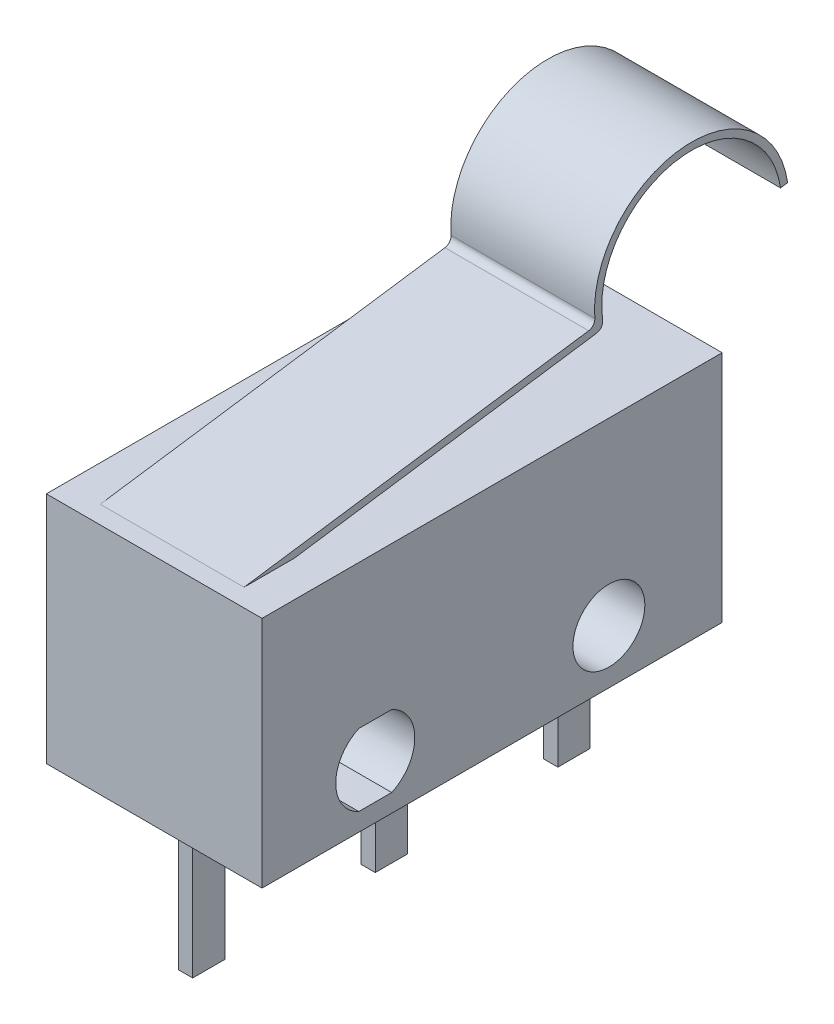
ISO-10303-21;
HEADER;
FILE_DESCRIPTION(('STEP AP214'),'2;1');
FILE_NAME('part.step','',(''),(''),'','','');
FILE_SCHEMA(('AUTOMOTIVE_DESIGN { 1 0 10303 214 1 1 1 1 }'));
ENDSEC;
DATA;
#1=APPLICATION_CONTEXT('core data for automotive mechanical design processes');
#2=APPLICATION_PROTOCOL_DEFINITION('international standard','automotive_design',2000,#1);
#3=PRODUCT_CONTEXT('',#1,'mechanical');
#4=PRODUCT('Part','Part','',(#3));
#5=PRODUCT_RELATED_PRODUCT_CATEGORY('part','',(#4));
#6=PRODUCT_DEFINITION_FORMATION('','',#4);
#7=PRODUCT_DEFINITION_CONTEXT('part definition',#1,'design');
#8=PRODUCT_DEFINITION('design','',#6,#7);
#9=PRODUCT_DEFINITION_SHAPE('','',#8);
#10=(LENGTH_UNIT() NAMED_UNIT(*) SI_UNIT(.MILLI.,.METRE.));
#11=(NAMED_UNIT(*) PLANE_ANGLE_UNIT() SI_UNIT($,.RADIAN.));
#12=(NAMED_UNIT(*) SI_UNIT($,.STERADIAN.) SOLID_ANGLE_UNIT());
#13=UNCERTAINTY_MEASURE_WITH_UNIT(LENGTH_MEASURE(1.E-05),#10,'distance_accuracy_value','');
#14=(GEOMETRIC_REPRESENTATION_CONTEXT(3) GLOBAL_UNCERTAINTY_ASSIGNED_CONTEXT((#13)) GLOBAL_UNIT_ASSIGNED_CONTEXT((#10,
#11,#12)) REPRESENTATION_CONTEXT('',''));
#15=CARTESIAN_POINT('',(0.,0.,0.));
#16=DIRECTION('',(0.,0.,1.));
#17=DIRECTION('',(1.,0.,0.));
#18=AXIS2_PLACEMENT_3D('',#15,#16,#17);
#19=CARTESIAN_POINT('',(3.,3.25,-6.4));
#20=DIRECTION('',(0.,-1.,0.));
#21=DIRECTION('',(0.,0.,-1.));
#22=AXIS2_PLACEMENT_3D('',#19,#20,#21);
#23=PLANE('',#22);
#24=DIRECTION('',(-1.,0.,0.));
#25=VECTOR('',#24,1.);
#26=CARTESIAN_POINT('',(0.5,3.25,1.82));
#27=LINE('',#26,#25);
#28=CARTESIAN_POINT('',(0.5,3.25,1.82));
#29=VERTEX_POINT('',#28);
#30=CARTESIAN_POINT('',(-0.5,3.25,1.82));
#31=VERTEX_POINT('',#30);
#32=EDGE_CURVE('E56',#29,#31,#27,.T.);
#33=ORIENTED_EDGE('',*,*,#32,.F.);
#34=DIRECTION('',(0.,0.,-1.));
#35=VECTOR('',#34,1.);
#36=CARTESIAN_POINT('',(0.5,3.25,2.48));
#37=LINE('',#36,#35);
#38=CARTESIAN_POINT('',(0.5,3.25,2.48));
#39=VERTEX_POINT('',#38);
#40=EDGE_CURVE('E51',#39,#29,#37,.T.);
#41=ORIENTED_EDGE('',*,*,#40,.F.);
#42=DIRECTION('',(-1.,0.,0.));
#43=VECTOR('',#42,1.);
#44=CARTESIAN_POINT('',(0.5,3.25,2.48));
#45=LINE('',#44,#43);
#46=CARTESIAN_POINT('',(-0.5,3.25,2.48));
#47=VERTEX_POINT('',#46);
#48=EDGE_CURVE('E228',#39,#47,#45,.T.);
#49=ORIENTED_EDGE('',*,*,#48,.T.);
#50=DIRECTION('',(0.,0.,-1.));
#51=VECTOR('',#50,1.);
#52=CARTESIAN_POINT('',(-0.5,3.25,2.48));
#53=LINE('',#52,#51);
#54=EDGE_CURVE('E231',#47,#31,#53,.T.);
#55=ORIENTED_EDGE('',*,*,#54,.T.);
#56=EDGE_LOOP('',(#33,#41,#49,#55));
#57=FACE_BOUND('',#56,.T.);
#58=DIRECTION('',(0.,0.,1.));
#59=VECTOR('',#58,1.);
#60=CARTESIAN_POINT('',(-3.,3.25,-6.4));
#61=LINE('',#60,#59);
#62=CARTESIAN_POINT('',(-3.,3.25,-6.4));
#63=VERTEX_POINT('',#62);
#64=CARTESIAN_POINT('',(-3.,3.25,6.4));
#65=VERTEX_POINT('',#64);
#66=EDGE_CURVE('E423',#63,#65,#61,.T.);
#67=ORIENTED_EDGE('',*,*,#66,.T.);
#68=DIRECTION('',(-1.,0.,0.));
#69=VECTOR('',#68,1.);
#70=CARTESIAN_POINT('',(3.,3.25,6.4));
#71=LINE('',#70,#69);
#72=CARTESIAN_POINT('',(3.,3.25,6.4));
#73=VERTEX_POINT('',#72);
#74=EDGE_CURVE('E429',#73,#65,#71,.T.);
#75=ORIENTED_EDGE('',*,*,#74,.F.);
#76=DIRECTION('',(0.,0.,1.));
#77=VECTOR('',#76,1.);
#78=CARTESIAN_POINT('',(3.,3.25,-6.4));
#79=LINE('',#78,#77);
#80=CARTESIAN_POINT('',(3.,3.25,-6.4));
#81=VERTEX_POINT('',#80);
#82=EDGE_CURVE('E427',#81,#73,#79,.T.);
#83=ORIENTED_EDGE('',*,*,#82,.F.);
#84=DIRECTION('',(-1.,0.,0.));
#85=VECTOR('',#84,1.);
#86=CARTESIAN_POINT('',(3.,3.25,-6.4));
#87=LINE('',#86,#85);
#88=EDGE_CURVE('E439',#81,#63,#87,.T.);
#89=ORIENTED_EDGE('',*,*,#88,.T.);
#90=EDGE_LOOP('',(#67,#75,#83,#89));
#91=FACE_BOUND('',#90,.T.);
#92=DIRECTION('',(0.,0.,-1.));
#93=VECTOR('',#92,1.);
#94=CARTESIAN_POINT('',(2.,3.25,4.5022836084845));
#95=LINE('',#94,#93);
#96=CARTESIAN_POINT('',(2.,3.25,5.9));
#97=VERTEX_POINT('',#96);
#98=CARTESIAN_POINT('',(2.,3.25,4.5022836084845));
#99=VERTEX_POINT('',#98);
#100=EDGE_CURVE('E249',#97,#99,#95,.T.);
#101=ORIENTED_EDGE('',*,*,#100,.F.);
#102=DIRECTION('',(-1.,0.,0.));
#103=VECTOR('',#102,1.);
#104=CARTESIAN_POINT('',(2.,3.25,5.9));
#105=LINE('',#104,#103);
#106=CARTESIAN_POINT('',(-2.,3.25,5.9));
#107=VERTEX_POINT('',#106);
#108=EDGE_CURVE('E265',#97,#107,#105,.T.);
#109=ORIENTED_EDGE('',*,*,#108,.T.);
#110=DIRECTION('',(0.,0.,-1.));
#111=VECTOR('',#110,1.);
#112=CARTESIAN_POINT('',(-2.,3.25,4.5022836084845));
#113=LINE('',#112,#111);
#114=CARTESIAN_POINT('',(-2.,3.25,4.5022836084845));
#115=VERTEX_POINT('',#114);
#116=EDGE_CURVE('E235',#107,#115,#113,.T.);
#117=ORIENTED_EDGE('',*,*,#116,.T.);
#118=DIRECTION('',(-1.,0.,0.));
#119=VECTOR('',#118,1.);
#120=CARTESIAN_POINT('',(2.,3.25,4.5022836084845));
#121=LINE('',#120,#119);
#122=EDGE_CURVE('E287',#99,#115,#121,.T.);
#123=ORIENTED_EDGE('',*,*,#122,.F.);
#124=EDGE_LOOP('',(#101,#109,#117,#123));
#125=FACE_BOUND('',#124,.T.);
#126=ADVANCED_FACE('F36',(#57,#91,#125),#23,.F.);
#127=CARTESIAN_POINT('',(3.,-3.25,-6.4));
#128=DIRECTION('',(0.,1.,0.));
#129=DIRECTION('',(0.,0.,1.));
#130=AXIS2_PLACEMENT_3D('',#127,#128,#129);
#131=PLANE('',#130);
#132=DIRECTION('',(-1.,0.,0.));
#133=VECTOR('',#132,1.);
#134=CARTESIAN_POINT('',(0.2,-3.25,-4.63));
#135=LINE('',#134,#133);
#136=CARTESIAN_POINT('',(0.2,-3.25,-4.63));
#137=VERTEX_POINT('',#136);
#138=CARTESIAN_POINT('',(-0.2,-3.25,-4.63));
#139=VERTEX_POINT('',#138);
#140=EDGE_CURVE('E302',#137,#139,#135,.T.);
#141=ORIENTED_EDGE('',*,*,#140,.F.);
#142=DIRECTION('',(0.,0.,1.));
#143=VECTOR('',#142,1.);
#144=CARTESIAN_POINT('',(0.2,-3.25,-4.63));
#145=LINE('',#144,#143);
#146=CARTESIAN_POINT('',(0.2,-3.25,-5.53));
#147=VERTEX_POINT('',#146);
#148=EDGE_CURVE('E299',#147,#137,#145,.T.);
#149=ORIENTED_EDGE('',*,*,#148,.F.);
#150=DIRECTION('',(-1.,0.,0.));
#151=VECTOR('',#150,1.);
#152=CARTESIAN_POINT('',(0.2,-3.25,-5.53));
#153=LINE('',#152,#151);
#154=CARTESIAN_POINT('',(-0.2,-3.25,-5.53));
#155=VERTEX_POINT('',#154);
#156=EDGE_CURVE('E313',#147,#155,#153,.T.);
#157=ORIENTED_EDGE('',*,*,#156,.T.);
#158=DIRECTION('',(0.,0.,1.));
#159=VECTOR('',#158,1.);
#160=CARTESIAN_POINT('',(-0.2,-3.25,-4.63));
#161=LINE('',#160,#159);
#162=EDGE_CURVE('E294',#155,#139,#161,.T.);
#163=ORIENTED_EDGE('',*,*,#162,.T.);
#164=EDGE_LOOP('',(#141,#149,#157,#163));
#165=FACE_BOUND('',#164,.T.);
#166=DIRECTION('',(0.,0.,-1.));
#167=VECTOR('',#166,1.);
#168=CARTESIAN_POINT('',(-3.,-3.25,-6.4));
#169=LINE('',#168,#167);
#170=CARTESIAN_POINT('',(-3.,-3.25,6.4));
#171=VERTEX_POINT('',#170);
#172=CARTESIAN_POINT('',(-3.,-3.25,-6.4));
#173=VERTEX_POINT('',#172);
#174=EDGE_CURVE('E432',#171,#173,#169,.T.);
#175=ORIENTED_EDGE('',*,*,#174,.T.);
#176=DIRECTION('',(-1.,0.,0.));
#177=VECTOR('',#176,1.);
#178=CARTESIAN_POINT('',(3.,-3.25,-6.4));
#179=LINE('',#178,#177);
#180=CARTESIAN_POINT('',(3.,-3.25,-6.4));
#181=VERTEX_POINT('',#180);
#182=EDGE_CURVE('E442',#181,#173,#179,.T.);
#183=ORIENTED_EDGE('',*,*,#182,.F.);
#184=DIRECTION('',(0.,0.,-1.));
#185=VECTOR('',#184,1.);
#186=CARTESIAN_POINT('',(3.,-3.25,-6.4));
#187=LINE('',#186,#185);
#188=CARTESIAN_POINT('',(3.,-3.25,6.4));
#189=VERTEX_POINT('',#188);
#190=EDGE_CURVE('E422',#189,#181,#187,.T.);
#191=ORIENTED_EDGE('',*,*,#190,.F.);
#192=DIRECTION('',(-1.,0.,0.));
#193=VECTOR('',#192,1.);
#194=CARTESIAN_POINT('',(3.,-3.25,6.4));
#195=LINE('',#194,#193);
#196=EDGE_CURVE('E445',#189,#171,#195,.T.);
#197=ORIENTED_EDGE('',*,*,#196,.T.);
#198=EDGE_LOOP('',(#175,#183,#191,#197));
#199=FACE_BOUND('',#198,.T.);
#200=DIRECTION('',(-1.,0.,0.));
#201=VECTOR('',#200,1.);
#202=CARTESIAN_POINT('',(0.2,-3.25,5.53));
#203=LINE('',#202,#201);
#204=CARTESIAN_POINT('',(0.2,-3.25,5.53));
#205=VERTEX_POINT('',#204);
#206=CARTESIAN_POINT('',(-0.2,-3.25,5.53));
#207=VERTEX_POINT('',#206);
#208=EDGE_CURVE('E378',#205,#207,#203,.T.);
#209=ORIENTED_EDGE('',*,*,#208,.F.);
#210=DIRECTION('',(0.,0.,1.));
#211=VECTOR('',#210,1.);
#212=CARTESIAN_POINT('',(0.2,-3.25,4.63));
#213=LINE('',#212,#211);
#214=CARTESIAN_POINT('',(0.2,-3.25,4.63));
#215=VERTEX_POINT('',#214);
#216=EDGE_CURVE('E352',#215,#205,#213,.T.);
#217=ORIENTED_EDGE('',*,*,#216,.F.);
#218=DIRECTION('',(-1.,0.,0.));
#219=VECTOR('',#218,1.);
#220=CARTESIAN_POINT('',(0.2,-3.25,4.63));
#221=LINE('',#220,#219);
#222=CARTESIAN_POINT('',(-0.2,-3.25,4.63));
#223=VERTEX_POINT('',#222);
#224=EDGE_CURVE('E363',#215,#223,#221,.T.);
#225=ORIENTED_EDGE('',*,*,#224,.T.);
#226=DIRECTION('',(0.,0.,1.));
#227=VECTOR('',#226,1.);
#228=CARTESIAN_POINT('',(-0.2,-3.25,4.63));
#229=LINE('',#228,#227);
#230=EDGE_CURVE('E351',#223,#207,#229,.T.);
#231=ORIENTED_EDGE('',*,*,#230,.T.);
#232=EDGE_LOOP('',(#209,#217,#225,#231));
#233=FACE_BOUND('',#232,.T.);
#234=DIRECTION('',(0.,0.,1.));
#235=VECTOR('',#234,1.);
#236=CARTESIAN_POINT('',(0.2,-3.25,-0.45));
#237=LINE('',#236,#235);
#238=CARTESIAN_POINT('',(0.2,-3.25,-0.45));
#239=VERTEX_POINT('',#238);
#240=CARTESIAN_POINT('',(0.2,-3.25,0.45));
#241=VERTEX_POINT('',#240);
#242=EDGE_CURVE('E324',#239,#241,#237,.T.);
#243=ORIENTED_EDGE('',*,*,#242,.F.);
#244=DIRECTION('',(-1.,0.,0.));
#245=VECTOR('',#244,1.);
#246=CARTESIAN_POINT('',(0.2,-3.25,-0.45));
#247=LINE('',#246,#245);
#248=CARTESIAN_POINT('',(-0.2,-3.25,-0.45));
#249=VERTEX_POINT('',#248);
#250=EDGE_CURVE('E348',#239,#249,#247,.T.);
#251=ORIENTED_EDGE('',*,*,#250,.T.);
#252=DIRECTION('',(0.,0.,1.));
#253=VECTOR('',#252,1.);
#254=CARTESIAN_POINT('',(-0.2,-3.25,-0.45));
#255=LINE('',#254,#253);
#256=CARTESIAN_POINT('',(-0.2,-3.25,0.450000000000001));
#257=VERTEX_POINT('',#256);
#258=EDGE_CURVE('E334',#249,#257,#255,.T.);
#259=ORIENTED_EDGE('',*,*,#258,.T.);
#260=DIRECTION('',(-1.,0.,0.));
#261=VECTOR('',#260,1.);
#262=CARTESIAN_POINT('',(0.2,-3.25,0.45));
#263=LINE('',#262,#261);
#264=EDGE_CURVE('E345',#241,#257,#263,.T.);
#265=ORIENTED_EDGE('',*,*,#264,.F.);
#266=EDGE_LOOP('',(#243,#251,#259,#265));
#267=FACE_BOUND('',#266,.T.);
#268=ADVANCED_FACE('F509',(#165,#199,#233,#267),#131,.F.);
#269=CARTESIAN_POINT('',(3.,0.,0.));
#270=DIRECTION('',(-1.,0.,0.));
#271=DIRECTION('',(0.,0.,1.));
#272=AXIS2_PLACEMENT_3D('',#269,#270,#271);
#273=PLANE('',#272);
#274=CARTESIAN_POINT('',(3.,-1.75,-3.25));
#275=DIRECTION('',(1.,0.,0.));
#276=DIRECTION('',(0.,0.,-1.));
#277=AXIS2_PLACEMENT_3D('',#274,#275,#276);
#278=CIRCLE('',#277,0.999999999999999);
#279=CARTESIAN_POINT('',(3.,-1.75,-4.25));
#280=VERTEX_POINT('',#279);
#281=EDGE_CURVE('E413',#280,#280,#278,.T.);
#282=ORIENTED_EDGE('',*,*,#281,.F.);
#283=EDGE_LOOP('',(#282));
#284=FACE_BOUND('',#283,.T.);
#285=DIRECTION('',(0.,-1.,0.));
#286=VECTOR('',#285,1.);
#287=CARTESIAN_POINT('',(3.,3.25,6.4));
#288=LINE('',#287,#286);
#289=EDGE_CURVE('E419',#73,#189,#288,.T.);
#290=ORIENTED_EDGE('',*,*,#289,.T.);
#291=ORIENTED_EDGE('',*,*,#190,.T.);
#292=DIRECTION('',(0.,1.,0.));
#293=VECTOR('',#292,1.);
#294=CARTESIAN_POINT('',(3.,3.25,-6.4));
#295=LINE('',#294,#293);
#296=EDGE_CURVE('E425',#181,#81,#295,.T.);
#297=ORIENTED_EDGE('',*,*,#296,.T.);
#298=ORIENTED_EDGE('',*,*,#82,.T.);
#299=EDGE_LOOP('',(#290,#291,#297,#298));
#300=FACE_BOUND('',#299,.T.);
#301=CARTESIAN_POINT('',(3.,-1.75,3.25));
#302=DIRECTION('',(1.,0.,0.));
#303=DIRECTION('',(0.,0.,-1.));
#304=AXIS2_PLACEMENT_3D('',#301,#302,#303);
#305=CIRCLE('',#304,1.1);
#306=CARTESIAN_POINT('',(3.,-0.75,3.70825756949558));
#307=VERTEX_POINT('',#306);
#308=CARTESIAN_POINT('',(3.,-2.75,3.70825756949558));
#309=VERTEX_POINT('',#308);
#310=EDGE_CURVE('E382',#307,#309,#305,.T.);
#311=ORIENTED_EDGE('',*,*,#310,.F.);
#312=DIRECTION('',(0.,0.,1.));
#313=VECTOR('',#312,1.);
#314=CARTESIAN_POINT('',(3.,-0.75,3.70825756949558));
#315=LINE('',#314,#313);
#316=CARTESIAN_POINT('',(3.,-0.75,2.79174243050441));
#317=VERTEX_POINT('',#316);
#318=EDGE_CURVE('E390',#317,#307,#315,.T.);
#319=ORIENTED_EDGE('',*,*,#318,.F.);
#320=CARTESIAN_POINT('',(3.,-1.75,3.25));
#321=DIRECTION('',(1.,0.,0.));
#322=DIRECTION('',(0.,0.,-1.));
#323=AXIS2_PLACEMENT_3D('',#320,#321,#322);
#324=CIRCLE('',#323,1.1);
#325=CARTESIAN_POINT('',(3.,-2.75,2.79174243050442));
#326=VERTEX_POINT('',#325);
#327=EDGE_CURVE('E387',#326,#317,#324,.T.);
#328=ORIENTED_EDGE('',*,*,#327,.F.);
#329=DIRECTION('',(0.,0.,-1.));
#330=VECTOR('',#329,1.);
#331=CARTESIAN_POINT('',(3.,-2.75,3.70825756949558));
#332=LINE('',#331,#330);
#333=EDGE_CURVE('E384',#309,#326,#332,.T.);
#334=ORIENTED_EDGE('',*,*,#333,.F.);
#335=EDGE_LOOP('',(#311,#319,#328,#334));
#336=FACE_BOUND('',#335,.T.);
#337=ADVANCED_FACE('F514',(#284,#300,#336),#273,.F.);
#338=CARTESIAN_POINT('',(-3.,0.,0.));
#339=DIRECTION('',(-1.,0.,0.));
#340=DIRECTION('',(0.,0.,1.));
#341=AXIS2_PLACEMENT_3D('',#338,#339,#340);
#342=PLANE('',#341);
#343=DIRECTION('',(0.,-1.,0.));
#344=VECTOR('',#343,1.);
#345=CARTESIAN_POINT('',(-3.,3.25,6.4));
#346=LINE('',#345,#344);
#347=EDGE_CURVE('E416',#65,#171,#346,.T.);
#348=ORIENTED_EDGE('',*,*,#347,.F.);
#349=ORIENTED_EDGE('',*,*,#66,.F.);
#350=DIRECTION('',(0.,1.,0.));
#351=VECTOR('',#350,1.);
#352=CARTESIAN_POINT('',(-3.,3.25,-6.4));
#353=LINE('',#352,#351);
#354=EDGE_CURVE('E434',#173,#63,#353,.T.);
#355=ORIENTED_EDGE('',*,*,#354,.F.);
#356=ORIENTED_EDGE('',*,*,#174,.F.);
#357=EDGE_LOOP('',(#348,#349,#355,#356));
#358=FACE_BOUND('',#357,.T.);
#359=CARTESIAN_POINT('',(-3.,-1.75,-3.25));
#360=DIRECTION('',(1.,0.,0.));
#361=DIRECTION('',(0.,0.,-1.));
#362=AXIS2_PLACEMENT_3D('',#359,#360,#361);
#363=CIRCLE('',#362,0.999999999999999);
#364=CARTESIAN_POINT('',(-3.,-1.75,-4.25));
#365=VERTEX_POINT('',#364);
#366=EDGE_CURVE('E412',#365,#365,#363,.T.);
#367=ORIENTED_EDGE('',*,*,#366,.T.);
#368=EDGE_LOOP('',(#367));
#369=FACE_BOUND('',#368,.T.);
#370=DIRECTION('',(0.,0.,1.));
#371=VECTOR('',#370,1.);
#372=CARTESIAN_POINT('',(-3.,-0.75,3.70825756949558));
#373=LINE('',#372,#371);
#374=CARTESIAN_POINT('',(-3.,-0.75,2.79174243050441));
#375=VERTEX_POINT('',#374);
#376=CARTESIAN_POINT('',(-3.,-0.75,3.70825756949558));
#377=VERTEX_POINT('',#376);
#378=EDGE_CURVE('E385',#375,#377,#373,.T.);
#379=ORIENTED_EDGE('',*,*,#378,.T.);
#380=CARTESIAN_POINT('',(-3.,-1.75,3.25));
#381=DIRECTION('',(1.,0.,0.));
#382=DIRECTION('',(0.,0.,-1.));
#383=AXIS2_PLACEMENT_3D('',#380,#381,#382);
#384=CIRCLE('',#383,1.1);
#385=CARTESIAN_POINT('',(-3.,-2.75,3.70825756949558));
#386=VERTEX_POINT('',#385);
#387=EDGE_CURVE('E381',#377,#386,#384,.T.);
#388=ORIENTED_EDGE('',*,*,#387,.T.);
#389=DIRECTION('',(0.,0.,-1.));
#390=VECTOR('',#389,1.);
#391=CARTESIAN_POINT('',(-3.,-2.75,3.70825756949558));
#392=LINE('',#391,#390);
#393=CARTESIAN_POINT('',(-3.,-2.75,2.79174243050442));
#394=VERTEX_POINT('',#393);
#395=EDGE_CURVE('E395',#386,#394,#392,.T.);
#396=ORIENTED_EDGE('',*,*,#395,.T.);
#397=CARTESIAN_POINT('',(-3.,-1.75,3.25));
#398=DIRECTION('',(1.,0.,0.));
#399=DIRECTION('',(0.,0.,-1.));
#400=AXIS2_PLACEMENT_3D('',#397,#398,#399);
#401=CIRCLE('',#400,1.1);
#402=EDGE_CURVE('E398',#394,#375,#401,.T.);
#403=ORIENTED_EDGE('',*,*,#402,.T.);
#404=EDGE_LOOP('',(#379,#388,#396,#403));
#405=FACE_BOUND('',#404,.T.);
#406=ADVANCED_FACE('F519',(#358,#369,#405),#342,.T.);
#407=CARTESIAN_POINT('',(3.,3.25,6.4));
#408=DIRECTION('',(0.,0.,-1.));
#409=DIRECTION('',(0.,1.,0.));
#410=AXIS2_PLACEMENT_3D('',#407,#408,#409);
#411=PLANE('',#410);
#412=ORIENTED_EDGE('',*,*,#347,.T.);
#413=ORIENTED_EDGE('',*,*,#196,.F.);
#414=ORIENTED_EDGE('',*,*,#289,.F.);
#415=ORIENTED_EDGE('',*,*,#74,.T.);
#416=EDGE_LOOP('',(#412,#413,#414,#415));
#417=FACE_BOUND('',#416,.T.);
#418=ADVANCED_FACE('F524',(#417),#411,.F.);
#419=CARTESIAN_POINT('',(3.,3.25,-6.4));
#420=DIRECTION('',(0.,0.,1.));
#421=DIRECTION('',(1.,0.,0.));
#422=AXIS2_PLACEMENT_3D('',#419,#420,#421);
#423=PLANE('',#422);
#424=ORIENTED_EDGE('',*,*,#354,.T.);
#425=ORIENTED_EDGE('',*,*,#88,.F.);
#426=ORIENTED_EDGE('',*,*,#296,.F.);
#427=ORIENTED_EDGE('',*,*,#182,.T.);
#428=EDGE_LOOP('',(#424,#425,#426,#427));
#429=FACE_BOUND('',#428,.T.);
#430=ADVANCED_FACE('F521',(#429),#423,.F.);
#431=CARTESIAN_POINT('',(3.,-1.75,-3.25));
#432=DIRECTION('',(-1.,0.,0.));
#433=DIRECTION('',(0.,0.,1.));
#434=AXIS2_PLACEMENT_3D('',#431,#432,#433);
#435=CYLINDRICAL_SURFACE('',#434,0.999999999999999);
#436=ORIENTED_EDGE('',*,*,#281,.T.);
#437=EDGE_LOOP('',(#436));
#438=FACE_BOUND('',#437,.T.);
#439=ORIENTED_EDGE('',*,*,#366,.F.);
#440=EDGE_LOOP('',(#439));
#441=FACE_BOUND('',#440,.T.);
#442=ADVANCED_FACE('F523',(#438,#441),#435,.F.);
#443=CARTESIAN_POINT('',(3.,-1.75,3.25));
#444=DIRECTION('',(-1.,0.,0.));
#445=DIRECTION('',(0.,0.,1.));
#446=AXIS2_PLACEMENT_3D('',#443,#444,#445);
#447=CYLINDRICAL_SURFACE('',#446,1.1);
#448=ORIENTED_EDGE('',*,*,#387,.F.);
#449=DIRECTION('',(-1.,0.,0.));
#450=VECTOR('',#449,1.);
#451=CARTESIAN_POINT('',(3.,-0.75,3.70825756949558));
#452=LINE('',#451,#450);
#453=EDGE_CURVE('E392',#307,#377,#452,.T.);
#454=ORIENTED_EDGE('',*,*,#453,.F.);
#455=ORIENTED_EDGE('',*,*,#310,.T.);
#456=DIRECTION('',(-1.,0.,0.));
#457=VECTOR('',#456,1.);
#458=CARTESIAN_POINT('',(3.,-2.75,3.70825756949558));
#459=LINE('',#458,#457);
#460=EDGE_CURVE('E409',#309,#386,#459,.T.);
#461=ORIENTED_EDGE('',*,*,#460,.T.);
#462=EDGE_LOOP('',(#448,#454,#455,#461));
#463=FACE_BOUND('',#462,.T.);
#464=ADVANCED_FACE('F802',(#463),#447,.F.);
#465=CARTESIAN_POINT('',(3.,-2.75,3.70825756949558));
#466=DIRECTION('',(0.,1.,0.));
#467=DIRECTION('',(0.,0.,1.));
#468=AXIS2_PLACEMENT_3D('',#465,#466,#467);
#469=PLANE('',#468);
#470=ORIENTED_EDGE('',*,*,#395,.F.);
#471=ORIENTED_EDGE('',*,*,#460,.F.);
#472=ORIENTED_EDGE('',*,*,#333,.T.);
#473=DIRECTION('',(-1.,0.,0.));
#474=VECTOR('',#473,1.);
#475=CARTESIAN_POINT('',(3.,-2.75,2.79174243050442));
#476=LINE('',#475,#474);
#477=EDGE_CURVE('E407',#326,#394,#476,.T.);
#478=ORIENTED_EDGE('',*,*,#477,.T.);
#479=EDGE_LOOP('',(#470,#471,#472,#478));
#480=FACE_BOUND('',#479,.T.);
#481=ADVANCED_FACE('F792',(#480),#469,.T.);
#482=CARTESIAN_POINT('',(3.,-1.75,3.25));
#483=DIRECTION('',(-1.,0.,0.));
#484=DIRECTION('',(0.,0.,1.));
#485=AXIS2_PLACEMENT_3D('',#482,#483,#484);
#486=CYLINDRICAL_SURFACE('',#485,1.1);
#487=ORIENTED_EDGE('',*,*,#402,.F.);
#488=ORIENTED_EDGE('',*,*,#477,.F.);
#489=ORIENTED_EDGE('',*,*,#327,.T.);
#490=DIRECTION('',(-1.,0.,0.));
#491=VECTOR('',#490,1.);
#492=CARTESIAN_POINT('',(3.,-0.75,2.79174243050441));
#493=LINE('',#492,#491);
#494=EDGE_CURVE('E405',#317,#375,#493,.T.);
#495=ORIENTED_EDGE('',*,*,#494,.T.);
#496=EDGE_LOOP('',(#487,#488,#489,#495));
#497=FACE_BOUND('',#496,.T.);
#498=ADVANCED_FACE('F782',(#497),#486,.F.);
#499=CARTESIAN_POINT('',(3.,-0.75,3.70825756949558));
#500=DIRECTION('',(0.,-1.,0.));
#501=DIRECTION('',(0.,0.,-1.));
#502=AXIS2_PLACEMENT_3D('',#499,#500,#501);
#503=PLANE('',#502);
#504=ORIENTED_EDGE('',*,*,#378,.F.);
#505=ORIENTED_EDGE('',*,*,#494,.F.);
#506=ORIENTED_EDGE('',*,*,#318,.T.);
#507=ORIENTED_EDGE('',*,*,#453,.T.);
#508=EDGE_LOOP('',(#504,#505,#506,#507));
#509=FACE_BOUND('',#508,.T.);
#510=ADVANCED_FACE('F765',(#509),#503,.T.);
#511=CARTESIAN_POINT('',(0.2,-3.25,5.53));
#512=DIRECTION('',(0.,0.,-1.));
#513=DIRECTION('',(0.,1.,0.));
#514=AXIS2_PLACEMENT_3D('',#511,#512,#513);
#515=PLANE('',#514);
#516=DIRECTION('',(0.,-1.,0.));
#517=VECTOR('',#516,1.);
#518=CARTESIAN_POINT('',(-0.2,-3.25,5.53));
#519=LINE('',#518,#517);
#520=CARTESIAN_POINT('',(-0.2,-7.25,5.53));
#521=VERTEX_POINT('',#520);
#522=EDGE_CURVE('E365',#207,#521,#519,.T.);
#523=ORIENTED_EDGE('',*,*,#522,.T.);
#524=DIRECTION('',(-1.,0.,0.));
#525=VECTOR('',#524,1.);
#526=CARTESIAN_POINT('',(0.2,-7.25,5.53));
#527=LINE('',#526,#525);
#528=CARTESIAN_POINT('',(0.2,-7.25,5.53));
#529=VERTEX_POINT('',#528);
#530=EDGE_CURVE('E375',#529,#521,#527,.T.);
#531=ORIENTED_EDGE('',*,*,#530,.F.);
#532=DIRECTION('',(0.,-1.,0.));
#533=VECTOR('',#532,1.);
#534=CARTESIAN_POINT('',(0.2,-3.25,5.53));
#535=LINE('',#534,#533);
#536=EDGE_CURVE('E355',#205,#529,#535,.T.);
#537=ORIENTED_EDGE('',*,*,#536,.F.);
#538=ORIENTED_EDGE('',*,*,#208,.T.);
#539=EDGE_LOOP('',(#523,#531,#537,#538));
#540=FACE_BOUND('',#539,.T.);
#541=ADVANCED_FACE('F755',(#540),#515,.F.);
#542=CARTESIAN_POINT('',(0.2,-7.25,5.53));
#543=DIRECTION('',(0.,1.,0.));
#544=DIRECTION('',(0.,0.,1.));
#545=AXIS2_PLACEMENT_3D('',#542,#543,#544);
#546=PLANE('',#545);
#547=DIRECTION('',(0.,0.,-1.));
#548=VECTOR('',#547,1.);
#549=CARTESIAN_POINT('',(-0.2,-7.25,5.53));
#550=LINE('',#549,#548);
#551=CARTESIAN_POINT('',(-0.2,-7.25,4.63));
#552=VERTEX_POINT('',#551);
#553=EDGE_CURVE('E367',#521,#552,#550,.T.);
#554=ORIENTED_EDGE('',*,*,#553,.T.);
#555=DIRECTION('',(-1.,0.,0.));
#556=VECTOR('',#555,1.);
#557=CARTESIAN_POINT('',(0.2,-7.25,4.63));
#558=LINE('',#557,#556);
#559=CARTESIAN_POINT('',(0.2,-7.25,4.63));
#560=VERTEX_POINT('',#559);
#561=EDGE_CURVE('E372',#560,#552,#558,.T.);
#562=ORIENTED_EDGE('',*,*,#561,.F.);
#563=DIRECTION('',(0.,0.,-1.));
#564=VECTOR('',#563,1.);
#565=CARTESIAN_POINT('',(0.2,-7.25,5.53));
#566=LINE('',#565,#564);
#567=EDGE_CURVE('E358',#529,#560,#566,.T.);
#568=ORIENTED_EDGE('',*,*,#567,.F.);
#569=ORIENTED_EDGE('',*,*,#530,.T.);
#570=EDGE_LOOP('',(#554,#562,#568,#569));
#571=FACE_BOUND('',#570,.T.);
#572=ADVANCED_FACE('F745',(#571),#546,.F.);
#573=CARTESIAN_POINT('',(0.2,-7.25,4.63));
#574=DIRECTION('',(0.,0.,1.));
#575=DIRECTION('',(1.,0.,0.));
#576=AXIS2_PLACEMENT_3D('',#573,#574,#575);
#577=PLANE('',#576);
#578=DIRECTION('',(0.,1.,0.));
#579=VECTOR('',#578,1.);
#580=CARTESIAN_POINT('',(-0.2,-7.25,4.63));
#581=LINE('',#580,#579);
#582=EDGE_CURVE('E356',#552,#223,#581,.T.);
#583=ORIENTED_EDGE('',*,*,#582,.T.);
#584=ORIENTED_EDGE('',*,*,#224,.F.);
#585=DIRECTION('',(0.,1.,0.));
#586=VECTOR('',#585,1.);
#587=CARTESIAN_POINT('',(0.2,-7.25,4.63));
#588=LINE('',#587,#586);
#589=EDGE_CURVE('E360',#560,#215,#588,.T.);
#590=ORIENTED_EDGE('',*,*,#589,.F.);
#591=ORIENTED_EDGE('',*,*,#561,.T.);
#592=EDGE_LOOP('',(#583,#584,#590,#591));
#593=FACE_BOUND('',#592,.T.);
#594=ADVANCED_FACE('F735',(#593),#577,.F.);
#595=CARTESIAN_POINT('',(0.2,0.,0.));
#596=DIRECTION('',(1.,0.,0.));
#597=DIRECTION('',(0.,0.,-1.));
#598=AXIS2_PLACEMENT_3D('',#595,#596,#597);
#599=PLANE('',#598);
#600=ORIENTED_EDGE('',*,*,#216,.T.);
#601=ORIENTED_EDGE('',*,*,#536,.T.);
#602=ORIENTED_EDGE('',*,*,#567,.T.);
#603=ORIENTED_EDGE('',*,*,#589,.T.);
#604=EDGE_LOOP('',(#600,#601,#602,#603));
#605=FACE_BOUND('',#604,.T.);
#606=ADVANCED_FACE('F725',(#605),#599,.T.);
#607=CARTESIAN_POINT('',(-0.2,0.,0.));
#608=DIRECTION('',(1.,0.,0.));
#609=DIRECTION('',(0.,0.,-1.));
#610=AXIS2_PLACEMENT_3D('',#607,#608,#609);
#611=PLANE('',#610);
#612=ORIENTED_EDGE('',*,*,#230,.F.);
#613=ORIENTED_EDGE('',*,*,#582,.F.);
#614=ORIENTED_EDGE('',*,*,#553,.F.);
#615=ORIENTED_EDGE('',*,*,#522,.F.);
#616=EDGE_LOOP('',(#612,#613,#614,#615));
#617=FACE_BOUND('',#616,.T.);
#618=ADVANCED_FACE('F715',(#617),#611,.F.);
#619=CARTESIAN_POINT('',(0.2,-3.25,-0.45));
#620=DIRECTION('',(0.,0.,1.));
#621=DIRECTION('',(0.,-1.,0.));
#622=AXIS2_PLACEMENT_3D('',#619,#620,#621);
#623=PLANE('',#622);
#624=DIRECTION('',(0.,1.,0.));
#625=VECTOR('',#624,1.);
#626=CARTESIAN_POINT('',(-0.2,-3.25,-0.45));
#627=LINE('',#626,#625);
#628=CARTESIAN_POINT('',(-0.2,-7.25,-0.45));
#629=VERTEX_POINT('',#628);
#630=EDGE_CURVE('E321',#629,#249,#627,.T.);
#631=ORIENTED_EDGE('',*,*,#630,.T.);
#632=ORIENTED_EDGE('',*,*,#250,.F.);
#633=DIRECTION('',(0.,1.,0.));
#634=VECTOR('',#633,1.);
#635=CARTESIAN_POINT('',(0.2,-3.25,-0.45));
#636=LINE('',#635,#634);
#637=CARTESIAN_POINT('',(0.2,-7.25,-0.45));
#638=VERTEX_POINT('',#637);
#639=EDGE_CURVE('E322',#638,#239,#636,.T.);
#640=ORIENTED_EDGE('',*,*,#639,.F.);
#641=DIRECTION('',(-1.,0.,0.));
#642=VECTOR('',#641,1.);
#643=CARTESIAN_POINT('',(0.2,-7.25,-0.45));
#644=LINE('',#643,#642);
#645=EDGE_CURVE('E331',#638,#629,#644,.T.);
#646=ORIENTED_EDGE('',*,*,#645,.T.);
#647=EDGE_LOOP('',(#631,#632,#640,#646));
#648=FACE_BOUND('',#647,.T.);
#649=ADVANCED_FACE('F705',(#648),#623,.F.);
#650=CARTESIAN_POINT('',(0.2,-3.25,0.45));
#651=DIRECTION('',(0.,0.,-1.));
#652=DIRECTION('',(0.,1.,0.));
#653=AXIS2_PLACEMENT_3D('',#650,#651,#652);
#654=PLANE('',#653);
#655=DIRECTION('',(0.,-1.,0.));
#656=VECTOR('',#655,1.);
#657=CARTESIAN_POINT('',(-0.2,-3.25,0.45));
#658=LINE('',#657,#656);
#659=CARTESIAN_POINT('',(-0.2,-7.25,0.45));
#660=VERTEX_POINT('',#659);
#661=EDGE_CURVE('E337',#257,#660,#658,.T.);
#662=ORIENTED_EDGE('',*,*,#661,.T.);
#663=DIRECTION('',(-1.,0.,0.));
#664=VECTOR('',#663,1.);
#665=CARTESIAN_POINT('',(0.2,-7.25,0.45));
#666=LINE('',#665,#664);
#667=CARTESIAN_POINT('',(0.2,-7.25,0.45));
#668=VERTEX_POINT('',#667);
#669=EDGE_CURVE('E342',#668,#660,#666,.T.);
#670=ORIENTED_EDGE('',*,*,#669,.F.);
#671=DIRECTION('',(0.,-1.,0.));
#672=VECTOR('',#671,1.);
#673=CARTESIAN_POINT('',(0.2,-3.25,0.45));
#674=LINE('',#673,#672);
#675=EDGE_CURVE('E327',#241,#668,#674,.T.);
#676=ORIENTED_EDGE('',*,*,#675,.F.);
#677=ORIENTED_EDGE('',*,*,#264,.T.);
#678=EDGE_LOOP('',(#662,#670,#676,#677));
#679=FACE_BOUND('',#678,.T.);
#680=ADVANCED_FACE('F695',(#679),#654,.F.);
#681=CARTESIAN_POINT('',(0.2,-7.25,-0.45));
#682=DIRECTION('',(0.,1.,0.));
#683=DIRECTION('',(0.,0.,1.));
#684=AXIS2_PLACEMENT_3D('',#681,#682,#683);
#685=PLANE('',#684);
#686=DIRECTION('',(0.,0.,-1.));
#687=VECTOR('',#686,1.);
#688=CARTESIAN_POINT('',(-0.2,-7.25,-0.45));
#689=LINE('',#688,#687);
#690=EDGE_CURVE('E325',#660,#629,#689,.T.);
#691=ORIENTED_EDGE('',*,*,#690,.T.);
#692=ORIENTED_EDGE('',*,*,#645,.F.);
#693=DIRECTION('',(0.,0.,-1.));
#694=VECTOR('',#693,1.);
#695=CARTESIAN_POINT('',(0.2,-7.25,-0.45));
#696=LINE('',#695,#694);
#697=EDGE_CURVE('E329',#668,#638,#696,.T.);
#698=ORIENTED_EDGE('',*,*,#697,.F.);
#699=ORIENTED_EDGE('',*,*,#669,.T.);
#700=EDGE_LOOP('',(#691,#692,#698,#699));
#701=FACE_BOUND('',#700,.T.);
#702=ADVANCED_FACE('F685',(#701),#685,.F.);
#703=CARTESIAN_POINT('',(0.2,0.,0.));
#704=DIRECTION('',(-1.,0.,0.));
#705=DIRECTION('',(0.,0.,1.));
#706=AXIS2_PLACEMENT_3D('',#703,#704,#705);
#707=PLANE('',#706);
#708=ORIENTED_EDGE('',*,*,#639,.T.);
#709=ORIENTED_EDGE('',*,*,#242,.T.);
#710=ORIENTED_EDGE('',*,*,#675,.T.);
#711=ORIENTED_EDGE('',*,*,#697,.T.);
#712=EDGE_LOOP('',(#708,#709,#710,#711));
#713=FACE_BOUND('',#712,.T.);
#714=ADVANCED_FACE('F675',(#713),#707,.F.);
#715=CARTESIAN_POINT('',(-0.2,0.,0.));
#716=DIRECTION('',(-1.,0.,0.));
#717=DIRECTION('',(0.,0.,1.));
#718=AXIS2_PLACEMENT_3D('',#715,#716,#717);
#719=PLANE('',#718);
#720=ORIENTED_EDGE('',*,*,#630,.F.);
#721=ORIENTED_EDGE('',*,*,#690,.F.);
#722=ORIENTED_EDGE('',*,*,#661,.F.);
#723=ORIENTED_EDGE('',*,*,#258,.F.);
#724=EDGE_LOOP('',(#720,#721,#722,#723));
#725=FACE_BOUND('',#724,.T.);
#726=ADVANCED_FACE('F665',(#725),#719,.T.);
#727=CARTESIAN_POINT('',(0.2,-3.25,-4.63));
#728=DIRECTION('',(0.,0.,-1.));
#729=DIRECTION('',(-1.,0.,0.));
#730=AXIS2_PLACEMENT_3D('',#727,#728,#729);
#731=PLANE('',#730);
#732=DIRECTION('',(0.,-1.,0.));
#733=VECTOR('',#732,1.);
#734=CARTESIAN_POINT('',(-0.2,-3.25,-4.63));
#735=LINE('',#734,#733);
#736=CARTESIAN_POINT('',(-0.2,-7.25,-4.63));
#737=VERTEX_POINT('',#736);
#738=EDGE_CURVE('E289',#139,#737,#735,.T.);
#739=ORIENTED_EDGE('',*,*,#738,.T.);
#740=DIRECTION('',(-1.,0.,0.));
#741=VECTOR('',#740,1.);
#742=CARTESIAN_POINT('',(0.2,-7.25,-4.63));
#743=LINE('',#742,#741);
#744=CARTESIAN_POINT('',(0.2,-7.25,-4.63));
#745=VERTEX_POINT('',#744);
#746=EDGE_CURVE('E318',#745,#737,#743,.T.);
#747=ORIENTED_EDGE('',*,*,#746,.F.);
#748=DIRECTION('',(0.,-1.,0.));
#749=VECTOR('',#748,1.);
#750=CARTESIAN_POINT('',(0.2,-3.25,-4.63));
#751=LINE('',#750,#749);
#752=EDGE_CURVE('E290',#137,#745,#751,.T.);
#753=ORIENTED_EDGE('',*,*,#752,.F.);
#754=ORIENTED_EDGE('',*,*,#140,.T.);
#755=EDGE_LOOP('',(#739,#747,#753,#754));
#756=FACE_BOUND('',#755,.T.);
#757=ADVANCED_FACE('F655',(#756),#731,.F.);
#758=CARTESIAN_POINT('',(0.2,-7.25,-4.63));
#759=DIRECTION('',(0.,1.,0.));
#760=DIRECTION('',(0.,0.,1.));
#761=AXIS2_PLACEMENT_3D('',#758,#759,#760);
#762=PLANE('',#761);
#763=DIRECTION('',(0.,0.,-1.));
#764=VECTOR('',#763,1.);
#765=CARTESIAN_POINT('',(-0.2,-7.25,-4.63));
#766=LINE('',#765,#764);
#767=CARTESIAN_POINT('',(-0.2,-7.25,-5.53));
#768=VERTEX_POINT('',#767);
#769=EDGE_CURVE('E305',#737,#768,#766,.T.);
#770=ORIENTED_EDGE('',*,*,#769,.T.);
#771=DIRECTION('',(-1.,0.,0.));
#772=VECTOR('',#771,1.);
#773=CARTESIAN_POINT('',(0.2,-7.25,-5.53));
#774=LINE('',#773,#772);
#775=CARTESIAN_POINT('',(0.2,-7.25,-5.53));
#776=VERTEX_POINT('',#775);
#777=EDGE_CURVE('E315',#776,#768,#774,.T.);
#778=ORIENTED_EDGE('',*,*,#777,.F.);
#779=DIRECTION('',(0.,0.,-1.));
#780=VECTOR('',#779,1.);
#781=CARTESIAN_POINT('',(0.2,-7.25,-4.63));
#782=LINE('',#781,#780);
#783=EDGE_CURVE('E293',#745,#776,#782,.T.);
#784=ORIENTED_EDGE('',*,*,#783,.F.);
#785=ORIENTED_EDGE('',*,*,#746,.T.);
#786=EDGE_LOOP('',(#770,#778,#784,#785));
#787=FACE_BOUND('',#786,.T.);
#788=ADVANCED_FACE('F645',(#787),#762,.F.);
#789=CARTESIAN_POINT('',(0.2,-3.25,-5.53));
#790=DIRECTION('',(0.,0.,1.));
#791=DIRECTION('',(0.,-1.,0.));
#792=AXIS2_PLACEMENT_3D('',#789,#790,#791);
#793=PLANE('',#792);
#794=DIRECTION('',(0.,1.,0.));
#795=VECTOR('',#794,1.);
#796=CARTESIAN_POINT('',(-0.2,-3.25,-5.53));
#797=LINE('',#796,#795);
#798=EDGE_CURVE('E307',#768,#155,#797,.T.);
#799=ORIENTED_EDGE('',*,*,#798,.T.);
#800=ORIENTED_EDGE('',*,*,#156,.F.);
#801=DIRECTION('',(0.,1.,0.));
#802=VECTOR('',#801,1.);
#803=CARTESIAN_POINT('',(0.2,-3.25,-5.53));
#804=LINE('',#803,#802);
#805=EDGE_CURVE('E296',#776,#147,#804,.T.);
#806=ORIENTED_EDGE('',*,*,#805,.F.);
#807=ORIENTED_EDGE('',*,*,#777,.T.);
#808=EDGE_LOOP('',(#799,#800,#806,#807));
#809=FACE_BOUND('',#808,.T.);
#810=ADVANCED_FACE('F635',(#809),#793,.F.);
#811=CARTESIAN_POINT('',(0.2,0.,0.));
#812=DIRECTION('',(1.,0.,0.));
#813=DIRECTION('',(0.,0.,-1.));
#814=AXIS2_PLACEMENT_3D('',#811,#812,#813);
#815=PLANE('',#814);
#816=ORIENTED_EDGE('',*,*,#752,.T.);
#817=ORIENTED_EDGE('',*,*,#783,.T.);
#818=ORIENTED_EDGE('',*,*,#805,.T.);
#819=ORIENTED_EDGE('',*,*,#148,.T.);
#820=EDGE_LOOP('',(#816,#817,#818,#819));
#821=FACE_BOUND('',#820,.T.);
#822=ADVANCED_FACE('F628',(#821),#815,.T.);
#823=CARTESIAN_POINT('',(-0.2,0.,0.));
#824=DIRECTION('',(1.,0.,0.));
#825=DIRECTION('',(0.,0.,-1.));
#826=AXIS2_PLACEMENT_3D('',#823,#824,#825);
#827=PLANE('',#826);
#828=ORIENTED_EDGE('',*,*,#738,.F.);
#829=ORIENTED_EDGE('',*,*,#162,.F.);
#830=ORIENTED_EDGE('',*,*,#798,.F.);
#831=ORIENTED_EDGE('',*,*,#769,.F.);
#832=EDGE_LOOP('',(#828,#829,#830,#831));
#833=FACE_BOUND('',#832,.T.);
#834=ADVANCED_FACE('F599',(#833),#827,.F.);
#835=CARTESIAN_POINT('',(2.,4.49547827932291,-4.11227449016561));
#836=DIRECTION('',(0.,0.98970960184092,0.14309054484447));
#837=DIRECTION('',(0.,-0.14309054484447,0.98970960184092));
#838=AXIS2_PLACEMENT_3D('',#835,#836,#837);
#839=PLANE('',#838);
#840=DIRECTION('',(0.,0.143090544844471,-0.98970960184092));
#841=VECTOR('',#840,1.);
#842=CARTESIAN_POINT('',(-2.,4.49547827932291,-4.11227449016561));
#843=LINE('',#842,#841);
#844=CARTESIAN_POINT('',(-2.,4.46571360855175,-3.90640218399842));
#845=VERTEX_POINT('',#844);
#846=EDGE_CURVE('E268',#115,#845,#843,.T.);
#847=ORIENTED_EDGE('',*,*,#846,.T.);
#848=DIRECTION('',(-1.,0.,0.));
#849=VECTOR('',#848,1.);
#850=CARTESIAN_POINT('',(2.,4.46571360855175,-3.90640218399842));
#851=LINE('',#850,#849);
#852=CARTESIAN_POINT('',(2.,4.46571360855175,-3.90640218399842));
#853=VERTEX_POINT('',#852);
#854=EDGE_CURVE('E453',#845,#853,#851,.F.);
#855=ORIENTED_EDGE('',*,*,#854,.T.);
#856=DIRECTION('',(0.,0.143090544844471,-0.98970960184092));
#857=VECTOR('',#856,1.);
#858=CARTESIAN_POINT('',(2.,4.49547827932291,-4.11227449016561));
#859=LINE('',#858,#857);
#860=EDGE_CURVE('E252',#99,#853,#859,.T.);
#861=ORIENTED_EDGE('',*,*,#860,.F.);
#862=ORIENTED_EDGE('',*,*,#122,.T.);
#863=EDGE_LOOP('',(#847,#855,#861,#862));
#864=FACE_BOUND('',#863,.T.);
#865=ADVANCED_FACE('F506',(#864),#839,.F.);
#866=CARTESIAN_POINT('',(2.,5.05000000000006,-6.55));
#867=DIRECTION('',(-1.,0.,0.));
#868=DIRECTION('',(0.,0.,1.));
#869=AXIS2_PLACEMENT_3D('',#866,#867,#868);
#870=CYLINDRICAL_SURFACE('',#869,2.5);
#871=CARTESIAN_POINT('',(2.,5.05000000000006,-6.55));
#872=DIRECTION('',(-1.,0.,0.));
#873=DIRECTION('',(0.,0.,-1.));
#874=AXIS2_PLACEMENT_3D('',#871,#872,#873);
#875=CIRCLE('',#874,2.5);
#876=CARTESIAN_POINT('',(2.,4.69227363788883,-4.0757259953977));
#877=VERTEX_POINT('',#876);
#878=CARTESIAN_POINT('',(2.,5.40772636211118,-9.0242740046023));
#879=VERTEX_POINT('',#878);
#880=EDGE_CURVE('E256',#877,#879,#875,.T.);
#881=ORIENTED_EDGE('',*,*,#880,.F.);
#882=DIRECTION('',(-1.,0.,0.));
#883=VECTOR('',#882,1.);
#884=CARTESIAN_POINT('',(2.,4.69227363788883,-4.0757259953977));
#885=LINE('',#884,#883);
#886=CARTESIAN_POINT('',(-2.,4.69227363788883,-4.0757259953977));
#887=VERTEX_POINT('',#886);
#888=EDGE_CURVE('E448',#877,#887,#885,.T.);
#889=ORIENTED_EDGE('',*,*,#888,.T.);
#890=CARTESIAN_POINT('',(-2.,5.05000000000006,-6.55));
#891=DIRECTION('',(-1.,0.,0.));
#892=DIRECTION('',(0.,0.,-1.));
#893=AXIS2_PLACEMENT_3D('',#890,#891,#892);
#894=CIRCLE('',#893,2.5);
#895=CARTESIAN_POINT('',(-2.,5.40772636211118,-9.0242740046023));
#896=VERTEX_POINT('',#895);
#897=EDGE_CURVE('E271',#887,#896,#894,.T.);
#898=ORIENTED_EDGE('',*,*,#897,.T.);
#899=DIRECTION('',(-1.,0.,0.));
#900=VECTOR('',#899,1.);
#901=CARTESIAN_POINT('',(2.,5.40772636211118,-9.0242740046023));
#902=LINE('',#901,#900);
#903=EDGE_CURVE('E284',#879,#896,#902,.T.);
#904=ORIENTED_EDGE('',*,*,#903,.F.);
#905=EDGE_LOOP('',(#881,#889,#898,#904));
#906=FACE_BOUND('',#905,.T.);
#907=ADVANCED_FACE('F493',(#906),#870,.F.);
#908=CARTESIAN_POINT('',(2.,5.43634447108007,-9.22221592497048));
#909=DIRECTION('',(0.,0.98970960184092,0.143090544844471));
#910=DIRECTION('',(0.,-0.143090544844471,0.98970960184092));
#911=AXIS2_PLACEMENT_3D('',#908,#909,#910);
#912=PLANE('',#911);
#913=DIRECTION('',(0.,0.143090544844471,-0.98970960184092));
#914=VECTOR('',#913,1.);
#915=CARTESIAN_POINT('',(-2.,5.43634447108007,-9.22221592497048));
#916=LINE('',#915,#914);
#917=CARTESIAN_POINT('',(-2.,5.43634447108007,-9.22221592497049));
#918=VERTEX_POINT('',#917);
#919=EDGE_CURVE('E273',#896,#918,#916,.T.);
#920=ORIENTED_EDGE('',*,*,#919,.T.);
#921=DIRECTION('',(-1.,0.,0.));
#922=VECTOR('',#921,1.);
#923=CARTESIAN_POINT('',(2.,5.43634447108007,-9.22221592497049));
#924=LINE('',#923,#922);
#925=CARTESIAN_POINT('',(2.,5.43634447108007,-9.22221592497049));
#926=VERTEX_POINT('',#925);
#927=EDGE_CURVE('E281',#926,#918,#924,.T.);
#928=ORIENTED_EDGE('',*,*,#927,.F.);
#929=DIRECTION('',(0.,0.143090544844471,-0.98970960184092));
#930=VECTOR('',#929,1.);
#931=CARTESIAN_POINT('',(2.,5.43634447108007,-9.22221592497048));
#932=LINE('',#931,#930);
#933=EDGE_CURVE('E258',#879,#926,#932,.T.);
#934=ORIENTED_EDGE('',*,*,#933,.F.);
#935=ORIENTED_EDGE('',*,*,#903,.T.);
#936=EDGE_LOOP('',(#920,#928,#934,#935));
#937=FACE_BOUND('',#936,.T.);
#938=ADVANCED_FACE('F497',(#937),#912,.F.);
#939=CARTESIAN_POINT('',(2.,5.05000000000006,-6.55));
#940=DIRECTION('',(-1.,0.,0.));
#941=DIRECTION('',(0.,0.,1.));
#942=AXIS2_PLACEMENT_3D('',#939,#940,#941);
#943=CYLINDRICAL_SURFACE('',#942,2.7);
#944=CARTESIAN_POINT('',(-2.,5.05000000000006,-6.55));
#945=DIRECTION('',(1.,0.,0.));
#946=DIRECTION('',(0.,0.,1.));
#947=AXIS2_PLACEMENT_3D('',#944,#945,#946);
#948=CIRCLE('',#947,2.7);
#949=CARTESIAN_POINT('',(-2.,4.84886615145969,-3.85750205664492));
#950=VERTEX_POINT('',#949);
#951=EDGE_CURVE('E275',#918,#950,#948,.T.);
#952=ORIENTED_EDGE('',*,*,#951,.T.);
#953=DIRECTION('',(-1.,0.,0.));
#954=VECTOR('',#953,1.);
#955=CARTESIAN_POINT('',(2.,4.84886615145969,-3.85750205664492));
#956=LINE('',#955,#954);
#957=CARTESIAN_POINT('',(2.,4.84886615145969,-3.85750205664492));
#958=VERTEX_POINT('',#957);
#959=EDGE_CURVE('E460',#950,#958,#956,.F.);
#960=ORIENTED_EDGE('',*,*,#959,.T.);
#961=CARTESIAN_POINT('',(2.,5.05000000000006,-6.55));
#962=DIRECTION('',(1.,0.,0.));
#963=DIRECTION('',(0.,0.,1.));
#964=AXIS2_PLACEMENT_3D('',#961,#962,#963);
#965=CIRCLE('',#964,2.7);
#966=EDGE_CURVE('E260',#926,#958,#965,.T.);
#967=ORIENTED_EDGE('',*,*,#966,.F.);
#968=ORIENTED_EDGE('',*,*,#927,.T.);
#969=EDGE_LOOP('',(#952,#960,#967,#968));
#970=FACE_BOUND('',#969,.T.);
#971=ADVANCED_FACE('F472',(#970),#943,.T.);
#972=CARTESIAN_POINT('',(2.,3.25,5.9));
#973=DIRECTION('',(0.,-0.98970960184092,-0.14309054484447));
#974=DIRECTION('',(0.,0.14309054484447,-0.98970960184092));
#975=AXIS2_PLACEMENT_3D('',#972,#973,#974);
#976=PLANE('',#975);
#977=DIRECTION('',(0.,-0.14309054484447,0.98970960184092));
#978=VECTOR('',#977,1.);
#979=CARTESIAN_POINT('',(2.,3.25,5.9));
#980=LINE('',#979,#978);
#981=CARTESIAN_POINT('',(2.,4.63602542749592,-3.68667587351344));
#982=VERTEX_POINT('',#981);
#983=EDGE_CURVE('E263',#982,#97,#980,.T.);
#984=ORIENTED_EDGE('',*,*,#983,.F.);
#985=DIRECTION('',(1.,0.,0.));
#986=VECTOR('',#985,1.);
#987=CARTESIAN_POINT('',(-2.,4.63602542749592,-3.68667587351344));
#988=LINE('',#987,#986);
#989=CARTESIAN_POINT('',(-2.,4.63602542749592,-3.68667587351344));
#990=VERTEX_POINT('',#989);
#991=EDGE_CURVE('E457',#982,#990,#988,.F.);
#992=ORIENTED_EDGE('',*,*,#991,.T.);
#993=DIRECTION('',(0.,-0.14309054484447,0.98970960184092));
#994=VECTOR('',#993,1.);
#995=CARTESIAN_POINT('',(-2.,3.25,5.9));
#996=LINE('',#995,#994);
#997=EDGE_CURVE('E253',#990,#107,#996,.T.);
#998=ORIENTED_EDGE('',*,*,#997,.T.);
#999=ORIENTED_EDGE('',*,*,#108,.F.);
#1000=EDGE_LOOP('',(#984,#992,#998,#999));
#1001=FACE_BOUND('',#1000,.T.);
#1002=ADVANCED_FACE('F481',(#1001),#976,.F.);
#1003=CARTESIAN_POINT('',(2.,5.05000000000006,-6.55));
#1004=DIRECTION('',(-1.,0.,0.));
#1005=DIRECTION('',(0.,0.,1.));
#1006=AXIS2_PLACEMENT_3D('',#1003,#1004,#1005);
#1007=PLANE('',#1006);
#1008=ORIENTED_EDGE('',*,*,#860,.T.);
#1009=CARTESIAN_POINT('',(2.,4.66365552891993,-3.87778407502952));
#1010=DIRECTION('',(-1.,0.,0.));
#1011=DIRECTION('',(0.,0.,1.));
#1012=AXIS2_PLACEMENT_3D('',#1009,#1010,#1011);
#1013=CIRCLE('',#1012,0.2);
#1014=EDGE_CURVE('E455',#853,#877,#1013,.F.);
#1015=ORIENTED_EDGE('',*,*,#1014,.T.);
#1016=ORIENTED_EDGE('',*,*,#880,.T.);
#1017=ORIENTED_EDGE('',*,*,#933,.T.);
#1018=ORIENTED_EDGE('',*,*,#966,.T.);
#1019=CARTESIAN_POINT('',(2.,4.8339673478641,-3.65805776454454));
#1020=DIRECTION('',(-1.,0.,0.));
#1021=DIRECTION('',(0.,0.,1.));
#1022=AXIS2_PLACEMENT_3D('',#1019,#1020,#1021);
#1023=CIRCLE('',#1022,0.2);
#1024=EDGE_CURVE('E11',#958,#982,#1023,.T.);
#1025=ORIENTED_EDGE('',*,*,#1024,.T.);
#1026=ORIENTED_EDGE('',*,*,#983,.T.);
#1027=ORIENTED_EDGE('',*,*,#100,.T.);
#1028=EDGE_LOOP('',(#1008,#1015,#1016,#1017,#1018,#1025,#1026,#1027));
#1029=FACE_BOUND('',#1028,.T.);
#1030=ADVANCED_FACE('F478',(#1029),#1007,.F.);
#1031=CARTESIAN_POINT('',(-2.,5.05000000000006,-6.55));
#1032=DIRECTION('',(-1.,0.,0.));
#1033=DIRECTION('',(0.,0.,1.));
#1034=AXIS2_PLACEMENT_3D('',#1031,#1032,#1033);
#1035=PLANE('',#1034);
#1036=ORIENTED_EDGE('',*,*,#897,.F.);
#1037=CARTESIAN_POINT('',(-2.,4.66365552891993,-3.87778407502952));
#1038=DIRECTION('',(-1.,0.,0.));
#1039=DIRECTION('',(0.,0.,1.));
#1040=AXIS2_PLACEMENT_3D('',#1037,#1038,#1039);
#1041=CIRCLE('',#1040,0.2);
#1042=EDGE_CURVE('E451',#887,#845,#1041,.T.);
#1043=ORIENTED_EDGE('',*,*,#1042,.T.);
#1044=ORIENTED_EDGE('',*,*,#846,.F.);
#1045=ORIENTED_EDGE('',*,*,#116,.F.);
#1046=ORIENTED_EDGE('',*,*,#997,.F.);
#1047=CARTESIAN_POINT('',(-2.,4.8339673478641,-3.65805776454454));
#1048=DIRECTION('',(-1.,0.,0.));
#1049=DIRECTION('',(0.,0.,1.));
#1050=AXIS2_PLACEMENT_3D('',#1047,#1048,#1049);
#1051=CIRCLE('',#1050,0.2);
#1052=EDGE_CURVE('E44',#990,#950,#1051,.F.);
#1053=ORIENTED_EDGE('',*,*,#1052,.T.);
#1054=ORIENTED_EDGE('',*,*,#951,.F.);
#1055=ORIENTED_EDGE('',*,*,#919,.F.);
#1056=EDGE_LOOP('',(#1036,#1043,#1044,#1045,#1046,#1053,#1054,#1055));
#1057=FACE_BOUND('',#1056,.T.);
#1058=ADVANCED_FACE('F465',(#1057),#1035,.T.);
#1059=CARTESIAN_POINT('',(2.,4.66365552891993,-3.87778407502952));
#1060=DIRECTION('',(-1.,0.,0.));
#1061=DIRECTION('',(0.,0.,1.));
#1062=AXIS2_PLACEMENT_3D('',#1059,#1060,#1061);
#1063=CYLINDRICAL_SURFACE('',#1062,0.2);
#1064=ORIENTED_EDGE('',*,*,#1014,.F.);
#1065=ORIENTED_EDGE('',*,*,#854,.F.);
#1066=ORIENTED_EDGE('',*,*,#1042,.F.);
#1067=ORIENTED_EDGE('',*,*,#888,.F.);
#1068=EDGE_LOOP('',(#1064,#1065,#1066,#1067));
#1069=FACE_BOUND('',#1068,.T.);
#1070=ADVANCED_FACE('F491',(#1069),#1063,.T.);
#1071=CARTESIAN_POINT('',(2.,4.8339673478641,-3.65805776454454));
#1072=DIRECTION('',(-1.,0.,0.));
#1073=DIRECTION('',(0.,0.,1.));
#1074=AXIS2_PLACEMENT_3D('',#1071,#1072,#1073);
#1075=CYLINDRICAL_SURFACE('',#1074,0.2);
#1076=ORIENTED_EDGE('',*,*,#1024,.F.);
#1077=ORIENTED_EDGE('',*,*,#959,.F.);
#1078=ORIENTED_EDGE('',*,*,#1052,.F.);
#1079=ORIENTED_EDGE('',*,*,#991,.F.);
#1080=EDGE_LOOP('',(#1076,#1077,#1078,#1079));
#1081=FACE_BOUND('',#1080,.T.);
#1082=ADVANCED_FACE('F38',(#1081),#1075,.F.);
#1083=CARTESIAN_POINT('',(0.5,3.25,2.15));
#1084=DIRECTION('',(-1.,0.,0.));
#1085=DIRECTION('',(0.,0.,1.));
#1086=AXIS2_PLACEMENT_3D('',#1083,#1084,#1085);
#1087=CYLINDRICAL_SURFACE('',#1086,0.33);
#1088=CARTESIAN_POINT('',(-0.5,3.25,2.15));
#1089=DIRECTION('',(1.,0.,0.));
#1090=DIRECTION('',(0.,0.,-1.));
#1091=AXIS2_PLACEMENT_3D('',#1088,#1089,#1090);
#1092=CIRCLE('',#1091,0.33);
#1093=EDGE_CURVE('E240',#31,#47,#1092,.T.);
#1094=ORIENTED_EDGE('',*,*,#1093,.T.);
#1095=ORIENTED_EDGE('',*,*,#48,.F.);
#1096=CARTESIAN_POINT('',(0.5,3.25,2.15));
#1097=DIRECTION('',(1.,0.,0.));
#1098=DIRECTION('',(0.,0.,-1.));
#1099=AXIS2_PLACEMENT_3D('',#1096,#1097,#1098);
#1100=CIRCLE('',#1099,0.33);
#1101=EDGE_CURVE('E241',#29,#39,#1100,.T.);
#1102=ORIENTED_EDGE('',*,*,#1101,.F.);
#1103=ORIENTED_EDGE('',*,*,#32,.T.);
#1104=EDGE_LOOP('',(#1094,#1095,#1102,#1103));
#1105=FACE_BOUND('',#1104,.T.);
#1106=ADVANCED_FACE('F243',(#1105),#1087,.T.);
#1107=CARTESIAN_POINT('',(0.5,3.25,2.15));
#1108=DIRECTION('',(1.,0.,0.));
#1109=DIRECTION('',(0.,0.,-1.));
#1110=AXIS2_PLACEMENT_3D('',#1107,#1108,#1109);
#1111=PLANE('',#1110);
#1112=ORIENTED_EDGE('',*,*,#1101,.T.);
#1113=ORIENTED_EDGE('',*,*,#40,.T.);
#1114=EDGE_LOOP('',(#1112,#1113));
#1115=FACE_BOUND('',#1114,.T.);
#1116=ADVANCED_FACE('F579',(#1115),#1111,.T.);
#1117=CARTESIAN_POINT('',(-0.5,3.25,2.15));
#1118=DIRECTION('',(1.,0.,0.));
#1119=DIRECTION('',(0.,0.,-1.));
#1120=AXIS2_PLACEMENT_3D('',#1117,#1118,#1119);
#1121=PLANE('',#1120);
#1122=ORIENTED_EDGE('',*,*,#1093,.F.);
#1123=ORIENTED_EDGE('',*,*,#54,.F.);
#1124=EDGE_LOOP('',(#1122,#1123));
#1125=FACE_BOUND('',#1124,.T.);
#1126=ADVANCED_FACE('F239',(#1125),#1121,.F.);
#1127=CLOSED_SHELL('',(#126,#268,#337,#406,#418,#430,#442,#464,#481,#498,#510,#541,#572,#594,
#606,#618,#649,#680,#702,#714,#726,#757,#788,#810,#822,#834,#865,#907,#938,#971,#1002,#1030,
#1058,#1070,#1082,#1106,#1116,#1126));
#1128=MANIFOLD_SOLID_BREP('B2',#1127);
#1129=ADVANCED_BREP_SHAPE_REPRESENTATION('',(#18,#1128),#14);
#1130=SHAPE_DEFINITION_REPRESENTATION(#9,#1129);
ENDSEC;
END-ISO-10303-21;
